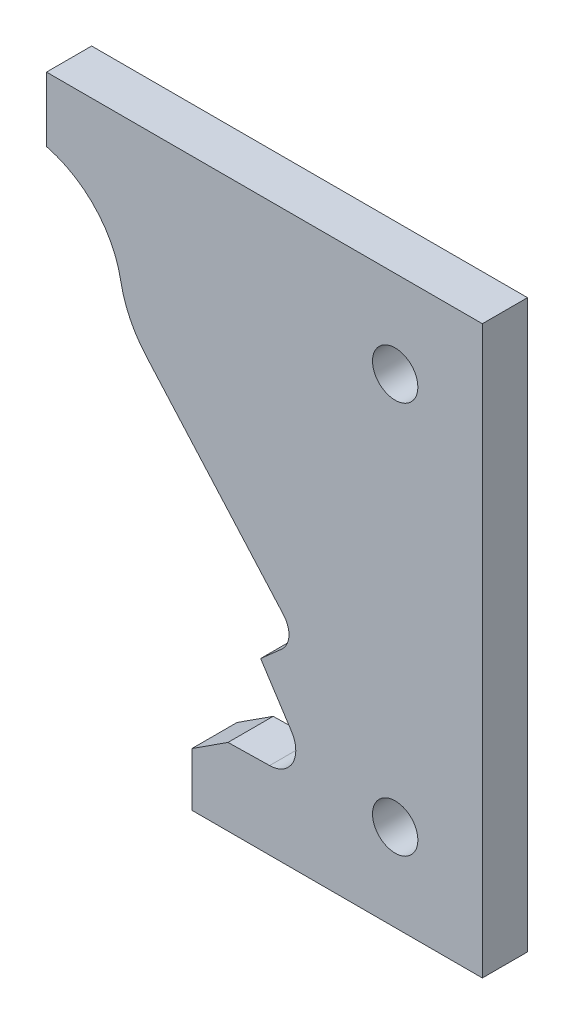
ISO-10303-21;
HEADER;
FILE_DESCRIPTION(('STEP AP214'),'2;1');
FILE_NAME('part.step','',(''),(''),'','','');
FILE_SCHEMA(('AUTOMOTIVE_DESIGN { 1 0 10303 214 1 1 1 1 }'));
ENDSEC;
DATA;
#1=APPLICATION_CONTEXT('core data for automotive mechanical design processes');
#2=APPLICATION_PROTOCOL_DEFINITION('international standard','automotive_design',2000,#1);
#3=PRODUCT_CONTEXT('',#1,'mechanical');
#4=PRODUCT('Part','Part','',(#3));
#5=PRODUCT_RELATED_PRODUCT_CATEGORY('part','',(#4));
#6=PRODUCT_DEFINITION_FORMATION('','',#4);
#7=PRODUCT_DEFINITION_CONTEXT('part definition',#1,'design');
#8=PRODUCT_DEFINITION('design','',#6,#7);
#9=PRODUCT_DEFINITION_SHAPE('','',#8);
#10=(LENGTH_UNIT() NAMED_UNIT(*) SI_UNIT(.MILLI.,.METRE.));
#11=(NAMED_UNIT(*) PLANE_ANGLE_UNIT() SI_UNIT($,.RADIAN.));
#12=(NAMED_UNIT(*) SI_UNIT($,.STERADIAN.) SOLID_ANGLE_UNIT());
#13=UNCERTAINTY_MEASURE_WITH_UNIT(LENGTH_MEASURE(1.E-05),#10,'distance_accuracy_value','');
#14=(GEOMETRIC_REPRESENTATION_CONTEXT(3) GLOBAL_UNCERTAINTY_ASSIGNED_CONTEXT((#13)) GLOBAL_UNIT_ASSIGNED_CONTEXT((#10,
#11,#12)) REPRESENTATION_CONTEXT('',''));
#15=CARTESIAN_POINT('',(0.,0.,0.));
#16=DIRECTION('',(0.,0.,1.));
#17=DIRECTION('',(1.,0.,0.));
#18=AXIS2_PLACEMENT_3D('',#15,#16,#17);
#19=CARTESIAN_POINT('',(36.1270333732644,-43.7914636928429,3.2893));
#20=DIRECTION('',(0.,0.,-1.));
#21=DIRECTION('',(-1.,0.,0.));
#22=AXIS2_PLACEMENT_3D('',#19,#20,#21);
#23=CYLINDRICAL_SURFACE('',#22,3.81);
#24=CARTESIAN_POINT('',(36.1270333732644,-43.7914636928429,-3.2893));
#25=DIRECTION('',(0.,0.,1.));
#26=DIRECTION('',(1.,0.,0.));
#27=AXIS2_PLACEMENT_3D('',#24,#25,#26);
#28=CIRCLE('',#27,3.81);
#29=CARTESIAN_POINT('',(36.1270333732644,-47.6014636928429,-3.2893));
#30=VERTEX_POINT('',#29);
#31=CARTESIAN_POINT('',(39.3256324450766,-41.721424085057,-3.2893));
#32=VERTEX_POINT('',#31);
#33=EDGE_CURVE('E153',#30,#32,#28,.T.);
#34=ORIENTED_EDGE('',*,*,#33,.F.);
#35=DIRECTION('',(0.,0.,-1.));
#36=VECTOR('',#35,1.);
#37=CARTESIAN_POINT('',(36.1270333732644,-47.6014636928429,3.2893));
#38=LINE('',#37,#36);
#39=CARTESIAN_POINT('',(36.1270333732644,-47.6014636928429,3.2893));
#40=VERTEX_POINT('',#39);
#41=EDGE_CURVE('E147',#40,#30,#38,.T.);
#42=ORIENTED_EDGE('',*,*,#41,.F.);
#43=CARTESIAN_POINT('',(36.1270333732644,-43.7914636928429,3.2893));
#44=DIRECTION('',(0.,0.,1.));
#45=DIRECTION('',(1.,0.,0.));
#46=AXIS2_PLACEMENT_3D('',#43,#44,#45);
#47=CIRCLE('',#46,3.81);
#48=CARTESIAN_POINT('',(39.3256324450766,-41.721424085057,3.2893));
#49=VERTEX_POINT('',#48);
#50=EDGE_CURVE('E150',#40,#49,#47,.T.);
#51=ORIENTED_EDGE('',*,*,#50,.T.);
#52=DIRECTION('',(0.,0.,-1.));
#53=VECTOR('',#52,1.);
#54=CARTESIAN_POINT('',(39.3256324450766,-41.721424085057,3.2893));
#55=LINE('',#54,#53);
#56=EDGE_CURVE('E205',#49,#32,#55,.T.);
#57=ORIENTED_EDGE('',*,*,#56,.T.);
#58=EDGE_LOOP('',(#34,#42,#51,#57));
#59=FACE_BOUND('',#58,.T.);
#60=ADVANCED_FACE('F47',(#59),#23,.F.);
#61=CARTESIAN_POINT('',(0.926057519267184,-48.2766989325326,3.2893));
#62=DIRECTION('',(0.0191787593313197,-0.999816070680258,0.));
#63=DIRECTION('',(0.999816070680258,0.0191787593313197,0.));
#64=AXIS2_PLACEMENT_3D('',#61,#62,#63);
#65=PLANE('',#64);
#66=DIRECTION('',(-0.999816070680258,-0.0191787593313197,0.));
#67=VECTOR('',#66,1.);
#68=CARTESIAN_POINT('',(0.926057519267184,-48.2766989325326,-3.2893));
#69=LINE('',#68,#67);
#70=CARTESIAN_POINT('',(30.0600424700748,-47.7178424567074,-3.2893));
#71=VERTEX_POINT('',#70);
#72=EDGE_CURVE('E209',#30,#71,#69,.T.);
#73=ORIENTED_EDGE('',*,*,#72,.T.);
#74=DIRECTION('',(0.,0.,-1.));
#75=VECTOR('',#74,1.);
#76=CARTESIAN_POINT('',(30.0600424700748,-47.7178424567074,3.2893));
#77=LINE('',#76,#75);
#78=CARTESIAN_POINT('',(30.0600424700748,-47.7178424567074,3.2893));
#79=VERTEX_POINT('',#78);
#80=EDGE_CURVE('E158',#79,#71,#77,.T.);
#81=ORIENTED_EDGE('',*,*,#80,.F.);
#82=DIRECTION('',(-0.999816070680258,-0.0191787593313197,0.));
#83=VECTOR('',#82,1.);
#84=CARTESIAN_POINT('',(0.926057519267184,-48.2766989325326,3.2893));
#85=LINE('',#84,#83);
#86=EDGE_CURVE('E161',#40,#79,#85,.T.);
#87=ORIENTED_EDGE('',*,*,#86,.F.);
#88=ORIENTED_EDGE('',*,*,#41,.T.);
#89=EDGE_LOOP('',(#73,#81,#87,#88));
#90=FACE_BOUND('',#89,.T.);
#91=ADVANCED_FACE('F162',(#90),#65,.F.);
#92=CARTESIAN_POINT('',(30.6390739213036,-47.3431102657428,3.2893));
#93=DIRECTION('',(-0.543317482358515,0.839527315436255,0.));
#94=DIRECTION('',(-0.839527315436255,-0.543317482358515,0.));
#95=AXIS2_PLACEMENT_3D('',#92,#93,#94);
#96=PLANE('',#95);
#97=DIRECTION('',(0.839527315436255,0.543317482358515,0.));
#98=VECTOR('',#97,1.);
#99=CARTESIAN_POINT('',(30.6390739213036,-47.3431102657428,-3.2893));
#100=LINE('',#99,#98);
#101=CARTESIAN_POINT('',(24.7935175974196,-51.1261830573972,-3.2893));
#102=VERTEX_POINT('',#101);
#103=EDGE_CURVE('E235',#102,#71,#100,.T.);
#104=ORIENTED_EDGE('',*,*,#103,.F.);
#105=DIRECTION('',(0.,0.,-1.));
#106=VECTOR('',#105,1.);
#107=CARTESIAN_POINT('',(24.7935175974196,-51.1261830573972,3.2893));
#108=LINE('',#107,#106);
#109=CARTESIAN_POINT('',(24.7935175974196,-51.1261830573972,3.2893));
#110=VERTEX_POINT('',#109);
#111=EDGE_CURVE('E287',#110,#102,#108,.T.);
#112=ORIENTED_EDGE('',*,*,#111,.F.);
#113=DIRECTION('',(0.839527315436255,0.543317482358515,0.));
#114=VECTOR('',#113,1.);
#115=CARTESIAN_POINT('',(30.6390739213036,-47.3431102657428,3.2893));
#116=LINE('',#115,#114);
#117=EDGE_CURVE('E166',#110,#79,#116,.T.);
#118=ORIENTED_EDGE('',*,*,#117,.T.);
#119=ORIENTED_EDGE('',*,*,#80,.T.);
#120=EDGE_LOOP('',(#104,#112,#118,#119));
#121=FACE_BOUND('',#120,.T.);
#122=ADVANCED_FACE('F340',(#121),#96,.T.);
#123=CARTESIAN_POINT('',(24.7935175974196,0.,3.2893));
#124=DIRECTION('',(1.,0.,0.));
#125=DIRECTION('',(0.,1.,0.));
#126=AXIS2_PLACEMENT_3D('',#123,#124,#125);
#127=PLANE('',#126);
#128=DIRECTION('',(0.,-1.,0.));
#129=VECTOR('',#128,1.);
#130=CARTESIAN_POINT('',(24.7935175974196,0.,-3.2893));
#131=LINE('',#130,#129);
#132=CARTESIAN_POINT('',(24.7935175974196,-58.9143197939274,-3.2893));
#133=VERTEX_POINT('',#132);
#134=EDGE_CURVE('E239',#102,#133,#131,.T.);
#135=ORIENTED_EDGE('',*,*,#134,.T.);
#136=DIRECTION('',(0.,0.,-1.));
#137=VECTOR('',#136,1.);
#138=CARTESIAN_POINT('',(24.7935175974196,-58.9143197939274,3.2893));
#139=LINE('',#138,#137);
#140=CARTESIAN_POINT('',(24.7935175974196,-58.9143197939274,3.2893));
#141=VERTEX_POINT('',#140);
#142=EDGE_CURVE('E289',#141,#133,#139,.T.);
#143=ORIENTED_EDGE('',*,*,#142,.F.);
#144=DIRECTION('',(0.,-1.,0.));
#145=VECTOR('',#144,1.);
#146=CARTESIAN_POINT('',(24.7935175974196,0.,3.2893));
#147=LINE('',#146,#145);
#148=EDGE_CURVE('E336',#110,#141,#147,.T.);
#149=ORIENTED_EDGE('',*,*,#148,.F.);
#150=ORIENTED_EDGE('',*,*,#111,.T.);
#151=EDGE_LOOP('',(#135,#143,#149,#150));
#152=FACE_BOUND('',#151,.T.);
#153=ADVANCED_FACE('F323',(#152),#127,.F.);
#154=CARTESIAN_POINT('',(0.,-58.9143197939274,3.2893));
#155=DIRECTION('',(0.,1.,0.));
#156=DIRECTION('',(0.,0.,1.));
#157=AXIS2_PLACEMENT_3D('',#154,#155,#156);
#158=PLANE('',#157);
#159=DIRECTION('',(1.,0.,0.));
#160=VECTOR('',#159,1.);
#161=CARTESIAN_POINT('',(0.,-58.9143197939274,-3.2893));
#162=LINE('',#161,#160);
#163=CARTESIAN_POINT('',(67.1159222864692,-58.9143197939274,-3.2893));
#164=VERTEX_POINT('',#163);
#165=EDGE_CURVE('E313',#133,#164,#162,.T.);
#166=ORIENTED_EDGE('',*,*,#165,.T.);
#167=DIRECTION('',(0.,0.,-1.));
#168=VECTOR('',#167,1.);
#169=CARTESIAN_POINT('',(67.1159222864692,-58.9143197939274,3.2893));
#170=LINE('',#169,#168);
#171=CARTESIAN_POINT('',(67.1159222864692,-58.9143197939274,3.2893));
#172=VERTEX_POINT('',#171);
#173=EDGE_CURVE('E292',#172,#164,#170,.T.);
#174=ORIENTED_EDGE('',*,*,#173,.F.);
#175=DIRECTION('',(1.,0.,0.));
#176=VECTOR('',#175,1.);
#177=CARTESIAN_POINT('',(0.,-58.9143197939274,3.2893));
#178=LINE('',#177,#176);
#179=EDGE_CURVE('E328',#141,#172,#178,.T.);
#180=ORIENTED_EDGE('',*,*,#179,.F.);
#181=ORIENTED_EDGE('',*,*,#142,.T.);
#182=EDGE_LOOP('',(#166,#174,#180,#181));
#183=FACE_BOUND('',#182,.T.);
#184=ADVANCED_FACE('F327',(#183),#158,.F.);
#185=CARTESIAN_POINT('',(67.1159222864692,0.,3.2893));
#186=DIRECTION('',(1.,0.,0.));
#187=DIRECTION('',(0.,0.,-1.));
#188=AXIS2_PLACEMENT_3D('',#185,#186,#187);
#189=PLANE('',#188);
#190=DIRECTION('',(0.,-1.,0.));
#191=VECTOR('',#190,1.);
#192=CARTESIAN_POINT('',(67.1159222864692,0.,-3.2893));
#193=LINE('',#192,#191);
#194=CARTESIAN_POINT('',(67.1159222864692,23.6356802060726,-3.2893));
#195=VERTEX_POINT('',#194);
#196=EDGE_CURVE('E312',#195,#164,#193,.T.);
#197=ORIENTED_EDGE('',*,*,#196,.F.);
#198=DIRECTION('',(0.,0.,-1.));
#199=VECTOR('',#198,1.);
#200=CARTESIAN_POINT('',(67.1159222864692,23.6356802060726,3.2893));
#201=LINE('',#200,#199);
#202=CARTESIAN_POINT('',(67.1159222864692,23.6356802060726,3.2893));
#203=VERTEX_POINT('',#202);
#204=EDGE_CURVE('E293',#203,#195,#201,.T.);
#205=ORIENTED_EDGE('',*,*,#204,.F.);
#206=DIRECTION('',(0.,-1.,0.));
#207=VECTOR('',#206,1.);
#208=CARTESIAN_POINT('',(67.1159222864692,0.,3.2893));
#209=LINE('',#208,#207);
#210=EDGE_CURVE('E333',#203,#172,#209,.T.);
#211=ORIENTED_EDGE('',*,*,#210,.T.);
#212=ORIENTED_EDGE('',*,*,#173,.T.);
#213=EDGE_LOOP('',(#197,#205,#211,#212));
#214=FACE_BOUND('',#213,.T.);
#215=ADVANCED_FACE('F330',(#214),#189,.T.);
#216=CARTESIAN_POINT('',(0.,23.6356802060726,3.2893));
#217=DIRECTION('',(0.,1.,0.));
#218=DIRECTION('',(-1.,0.,0.));
#219=AXIS2_PLACEMENT_3D('',#216,#217,#218);
#220=PLANE('',#219);
#221=DIRECTION('',(1.,0.,0.));
#222=VECTOR('',#221,1.);
#223=CARTESIAN_POINT('',(0.,23.6356802060726,-3.2893));
#224=LINE('',#223,#222);
#225=CARTESIAN_POINT('',(3.61592228646916,23.6356802060726,-3.2893));
#226=VERTEX_POINT('',#225);
#227=EDGE_CURVE('E308',#226,#195,#224,.T.);
#228=ORIENTED_EDGE('',*,*,#227,.F.);
#229=DIRECTION('',(0.,0.,-1.));
#230=VECTOR('',#229,1.);
#231=CARTESIAN_POINT('',(3.61592228646916,23.6356802060726,3.2893));
#232=LINE('',#231,#230);
#233=CARTESIAN_POINT('',(3.61592228646916,23.6356802060726,3.2893));
#234=VERTEX_POINT('',#233);
#235=EDGE_CURVE('E274',#234,#226,#232,.T.);
#236=ORIENTED_EDGE('',*,*,#235,.F.);
#237=DIRECTION('',(1.,0.,0.));
#238=VECTOR('',#237,1.);
#239=CARTESIAN_POINT('',(0.,23.6356802060726,3.2893));
#240=LINE('',#239,#238);
#241=EDGE_CURVE('E334',#234,#203,#240,.T.);
#242=ORIENTED_EDGE('',*,*,#241,.T.);
#243=ORIENTED_EDGE('',*,*,#204,.T.);
#244=EDGE_LOOP('',(#228,#236,#242,#243));
#245=FACE_BOUND('',#244,.T.);
#246=ADVANCED_FACE('F311',(#245),#220,.T.);
#247=CARTESIAN_POINT('',(3.61592228646917,0.,3.2893));
#248=DIRECTION('',(1.,0.,0.));
#249=DIRECTION('',(0.,1.,0.));
#250=AXIS2_PLACEMENT_3D('',#247,#248,#249);
#251=PLANE('',#250);
#252=DIRECTION('',(0.,-1.,0.));
#253=VECTOR('',#252,1.);
#254=CARTESIAN_POINT('',(3.61592228646917,0.,-3.2893));
#255=LINE('',#254,#253);
#256=CARTESIAN_POINT('',(3.61592228646916,14.237438208854,-3.2893));
#257=VERTEX_POINT('',#256);
#258=EDGE_CURVE('E257',#226,#257,#255,.T.);
#259=ORIENTED_EDGE('',*,*,#258,.T.);
#260=DIRECTION('',(0.,0.,-1.));
#261=VECTOR('',#260,1.);
#262=CARTESIAN_POINT('',(3.61592228646916,14.237438208854,3.2893));
#263=LINE('',#262,#261);
#264=CARTESIAN_POINT('',(3.61592228646916,14.237438208854,3.2893));
#265=VERTEX_POINT('',#264);
#266=EDGE_CURVE('E271',#265,#257,#263,.T.);
#267=ORIENTED_EDGE('',*,*,#266,.F.);
#268=DIRECTION('',(0.,-1.,0.));
#269=VECTOR('',#268,1.);
#270=CARTESIAN_POINT('',(3.61592228646917,0.,3.2893));
#271=LINE('',#270,#269);
#272=EDGE_CURVE('E196',#234,#265,#271,.T.);
#273=ORIENTED_EDGE('',*,*,#272,.F.);
#274=ORIENTED_EDGE('',*,*,#235,.T.);
#275=EDGE_LOOP('',(#259,#267,#273,#274));
#276=FACE_BOUND('',#275,.T.);
#277=ADVANCED_FACE('F302',(#276),#251,.F.);
#278=CARTESIAN_POINT('',(0.00718526177838179,0.00667398037258216,3.2893));
#279=DIRECTION('',(0.,0.,-1.));
#280=DIRECTION('',(-1.,0.,0.));
#281=AXIS2_PLACEMENT_3D('',#278,#279,#280);
#282=CYLINDRICAL_SURFACE('',#281,14.6812);
#283=CARTESIAN_POINT('',(0.00718526177838179,0.00667398037258216,-3.2893));
#284=DIRECTION('',(0.,0.,1.));
#285=DIRECTION('',(1.,0.,0.));
#286=AXIS2_PLACEMENT_3D('',#283,#284,#285);
#287=CIRCLE('',#286,14.6812);
#288=CARTESIAN_POINT('',(14.4650532696959,2.55769066115574,-3.2893));
#289=VERTEX_POINT('',#288);
#290=EDGE_CURVE('E250',#289,#257,#287,.T.);
#291=ORIENTED_EDGE('',*,*,#290,.F.);
#292=DIRECTION('',(0.,0.,-1.));
#293=VECTOR('',#292,1.);
#294=CARTESIAN_POINT('',(14.4650532696959,2.55769066115574,3.2893));
#295=LINE('',#294,#293);
#296=CARTESIAN_POINT('',(14.4650532696959,2.55769066115574,3.2893));
#297=VERTEX_POINT('',#296);
#298=EDGE_CURVE('E268',#297,#289,#295,.T.);
#299=ORIENTED_EDGE('',*,*,#298,.F.);
#300=CARTESIAN_POINT('',(0.00718526177838179,0.00667398037258216,3.2893));
#301=DIRECTION('',(0.,0.,1.));
#302=DIRECTION('',(1.,0.,0.));
#303=AXIS2_PLACEMENT_3D('',#300,#301,#302);
#304=CIRCLE('',#303,14.6812);
#305=EDGE_CURVE('E190',#297,#265,#304,.T.);
#306=ORIENTED_EDGE('',*,*,#305,.T.);
#307=ORIENTED_EDGE('',*,*,#266,.T.);
#308=EDGE_LOOP('',(#291,#299,#306,#307));
#309=FACE_BOUND('',#308,.T.);
#310=ADVANCED_FACE('F399',(#309),#282,.F.);
#311=CARTESIAN_POINT('',(30.0600424700748,5.55858584420667,3.2893));
#312=DIRECTION('',(0.,0.,-1.));
#313=DIRECTION('',(-1.,0.,0.));
#314=AXIS2_PLACEMENT_3D('',#311,#312,#313);
#315=CYLINDRICAL_SURFACE('',#314,15.8810912742037);
#316=CARTESIAN_POINT('',(30.0600424700748,5.55858584420667,-3.2893));
#317=DIRECTION('',(0.,0.,1.));
#318=DIRECTION('',(1.,0.,0.));
#319=AXIS2_PLACEMENT_3D('',#316,#317,#318);
#320=CIRCLE('',#319,15.8810912742037);
#321=CARTESIAN_POINT('',(18.1591070687582,-4.95696438549039,-3.2893));
#322=VERTEX_POINT('',#321);
#323=EDGE_CURVE('E256',#322,#289,#320,.F.);
#324=ORIENTED_EDGE('',*,*,#323,.F.);
#325=DIRECTION('',(0.,0.,-1.));
#326=VECTOR('',#325,1.);
#327=CARTESIAN_POINT('',(18.1591070687582,-4.95696438549039,3.2893));
#328=LINE('',#327,#326);
#329=CARTESIAN_POINT('',(18.1591070687582,-4.95696438549039,3.2893));
#330=VERTEX_POINT('',#329);
#331=EDGE_CURVE('E227',#330,#322,#328,.T.);
#332=ORIENTED_EDGE('',*,*,#331,.F.);
#333=CARTESIAN_POINT('',(30.0600424700748,5.55858584420667,3.2893));
#334=DIRECTION('',(0.,0.,1.));
#335=DIRECTION('',(1.,0.,0.));
#336=AXIS2_PLACEMENT_3D('',#333,#334,#335);
#337=CIRCLE('',#336,15.8810912742037);
#338=EDGE_CURVE('E195',#330,#297,#337,.F.);
#339=ORIENTED_EDGE('',*,*,#338,.T.);
#340=ORIENTED_EDGE('',*,*,#298,.T.);
#341=EDGE_LOOP('',(#324,#332,#339,#340));
#342=FACE_BOUND('',#341,.T.);
#343=ADVANCED_FACE('F402',(#342),#315,.T.);
#344=CARTESIAN_POINT('',(7.73793258064781,6.83716161645664,3.2893));
#345=DIRECTION('',(-0.749377684180158,-0.662142799139871,0.));
#346=DIRECTION('',(0.662142799139871,-0.749377684180158,0.));
#347=AXIS2_PLACEMENT_3D('',#344,#345,#346);
#348=PLANE('',#347);
#349=DIRECTION('',(-0.662142799139871,0.749377684180158,0.));
#350=VECTOR('',#349,1.);
#351=CARTESIAN_POINT('',(7.73793258064781,6.83716161645664,-3.2893));
#352=LINE('',#351,#350);
#353=CARTESIAN_POINT('',(38.1429154940791,-27.5735662700387,-3.2893));
#354=VERTEX_POINT('',#353);
#355=EDGE_CURVE('E344',#354,#322,#352,.T.);
#356=ORIENTED_EDGE('',*,*,#355,.F.);
#357=DIRECTION('',(0.,0.,-1.));
#358=VECTOR('',#357,1.);
#359=CARTESIAN_POINT('',(38.1429154940791,-27.5735662700387,3.2893));
#360=LINE('',#359,#358);
#361=CARTESIAN_POINT('',(38.1429154940791,-27.5735662700387,3.2893));
#362=VERTEX_POINT('',#361);
#363=EDGE_CURVE('E62',#354,#362,#360,.F.);
#364=ORIENTED_EDGE('',*,*,#363,.T.);
#365=DIRECTION('',(-0.662142799139871,0.749377684180158,0.));
#366=VECTOR('',#365,1.);
#367=CARTESIAN_POINT('',(7.73793258064781,6.83716161645664,3.2893));
#368=LINE('',#367,#366);
#369=EDGE_CURVE('E200',#362,#330,#368,.T.);
#370=ORIENTED_EDGE('',*,*,#369,.T.);
#371=ORIENTED_EDGE('',*,*,#331,.T.);
#372=EDGE_LOOP('',(#356,#364,#370,#371));
#373=FACE_BOUND('',#372,.T.);
#374=ADVANCED_FACE('F406',(#373),#348,.T.);
#375=CARTESIAN_POINT('',(32.5072863006915,-36.7900020337731,3.2893));
#376=DIRECTION('',(-0.66214279913971,0.7493776841803,0.));
#377=DIRECTION('',(-0.7493776841803,-0.66214279913971,0.));
#378=AXIS2_PLACEMENT_3D('',#375,#376,#377);
#379=PLANE('',#378);
#380=DIRECTION('',(0.7493776841803,0.66214279913971,0.));
#381=VECTOR('',#380,1.);
#382=CARTESIAN_POINT('',(32.5072863006915,-36.7900020337731,3.2893));
#383=LINE('',#382,#381);
#384=CARTESIAN_POINT('',(34.8147023154232,-34.7511917902502,3.2893));
#385=VERTEX_POINT('',#384);
#386=CARTESIAN_POINT('',(37.8659447340757,-32.0551438045802,3.2893));
#387=VERTEX_POINT('',#386);
#388=EDGE_CURVE('E202',#385,#387,#383,.T.);
#389=ORIENTED_EDGE('',*,*,#388,.T.);
#390=DIRECTION('',(0.,0.,-1.));
#391=VECTOR('',#390,1.);
#392=CARTESIAN_POINT('',(37.8659447340757,-32.0551438045802,-3.2893));
#393=LINE('',#392,#391);
#394=CARTESIAN_POINT('',(37.8659447340757,-32.0551438045802,-3.2893));
#395=VERTEX_POINT('',#394);
#396=EDGE_CURVE('E157',#387,#395,#393,.T.);
#397=ORIENTED_EDGE('',*,*,#396,.T.);
#398=DIRECTION('',(0.7493776841803,0.66214279913971,0.));
#399=VECTOR('',#398,1.);
#400=CARTESIAN_POINT('',(32.5072863006915,-36.7900020337731,-3.2893));
#401=LINE('',#400,#399);
#402=CARTESIAN_POINT('',(34.8147023154232,-34.7511917902502,-3.2893));
#403=VERTEX_POINT('',#402);
#404=EDGE_CURVE('E175',#403,#395,#401,.T.);
#405=ORIENTED_EDGE('',*,*,#404,.F.);
#406=DIRECTION('',(0.,0.,-1.));
#407=VECTOR('',#406,1.);
#408=CARTESIAN_POINT('',(34.8147023154232,-34.7511917902502,3.2893));
#409=LINE('',#408,#407);
#410=EDGE_CURVE('E222',#385,#403,#409,.T.);
#411=ORIENTED_EDGE('',*,*,#410,.F.);
#412=EDGE_LOOP('',(#389,#397,#405,#411));
#413=FACE_BOUND('',#412,.T.);
#414=ADVANCED_FACE('F410',(#413),#379,.T.);
#415=CARTESIAN_POINT('',(8.68655852377377,5.62168618068611,3.2893));
#416=DIRECTION('',(-0.839527315436263,-0.543317482358502,0.));
#417=DIRECTION('',(0.543317482358502,-0.839527315436263,0.));
#418=AXIS2_PLACEMENT_3D('',#415,#416,#417);
#419=PLANE('',#418);
#420=DIRECTION('',(-0.543317482358502,0.839527315436263,0.));
#421=VECTOR('',#420,1.);
#422=CARTESIAN_POINT('',(8.68655852377377,5.62168618068611,-3.2893));
#423=LINE('',#422,#421);
#424=EDGE_CURVE('E172',#32,#403,#423,.T.);
#425=ORIENTED_EDGE('',*,*,#424,.F.);
#426=ORIENTED_EDGE('',*,*,#56,.F.);
#427=DIRECTION('',(-0.543317482358502,0.839527315436263,0.));
#428=VECTOR('',#427,1.);
#429=CARTESIAN_POINT('',(8.68655852377377,5.62168618068611,3.2893));
#430=LINE('',#429,#428);
#431=EDGE_CURVE('E171',#49,#385,#430,.T.);
#432=ORIENTED_EDGE('',*,*,#431,.T.);
#433=ORIENTED_EDGE('',*,*,#410,.T.);
#434=EDGE_LOOP('',(#425,#426,#432,#433));
#435=FACE_BOUND('',#434,.T.);
#436=ADVANCED_FACE('F413',(#435),#419,.T.);
#437=CARTESIAN_POINT('',(0.,0.,3.2893));
#438=DIRECTION('',(0.,0.,1.));
#439=DIRECTION('',(1.,0.,0.));
#440=AXIS2_PLACEMENT_3D('',#437,#438,#439);
#441=PLANE('',#440);
#442=CARTESIAN_POINT('',(54.4159222864692,10.9356802060726,3.2893));
#443=DIRECTION('',(0.,0.,1.));
#444=DIRECTION('',(1.,0.,0.));
#445=AXIS2_PLACEMENT_3D('',#442,#443,#444);
#446=CIRCLE('',#445,3.302);
#447=CARTESIAN_POINT('',(57.7179222864692,10.9356802060726,3.2893));
#448=VERTEX_POINT('',#447);
#449=EDGE_CURVE('E354',#448,#448,#446,.T.);
#450=ORIENTED_EDGE('',*,*,#449,.F.);
#451=EDGE_LOOP('',(#450));
#452=FACE_BOUND('',#451,.T.);
#453=CARTESIAN_POINT('',(54.4159222864692,-46.2143197939274,3.2893));
#454=DIRECTION('',(0.,0.,1.));
#455=DIRECTION('',(1.,0.,0.));
#456=AXIS2_PLACEMENT_3D('',#453,#454,#455);
#457=CIRCLE('',#456,3.302);
#458=CARTESIAN_POINT('',(57.7179222864692,-46.2143197939274,3.2893));
#459=VERTEX_POINT('',#458);
#460=EDGE_CURVE('E360',#459,#459,#457,.T.);
#461=ORIENTED_EDGE('',*,*,#460,.F.);
#462=EDGE_LOOP('',(#461));
#463=FACE_BOUND('',#462,.T.);
#464=ORIENTED_EDGE('',*,*,#50,.F.);
#465=ORIENTED_EDGE('',*,*,#86,.T.);
#466=ORIENTED_EDGE('',*,*,#117,.F.);
#467=ORIENTED_EDGE('',*,*,#148,.T.);
#468=ORIENTED_EDGE('',*,*,#179,.T.);
#469=ORIENTED_EDGE('',*,*,#210,.F.);
#470=ORIENTED_EDGE('',*,*,#241,.F.);
#471=ORIENTED_EDGE('',*,*,#272,.T.);
#472=ORIENTED_EDGE('',*,*,#305,.F.);
#473=ORIENTED_EDGE('',*,*,#338,.F.);
#474=ORIENTED_EDGE('',*,*,#369,.F.);
#475=CARTESIAN_POINT('',(35.7636413468071,-29.6758696573078,3.2893));
#476=DIRECTION('',(0.,0.,1.));
#477=DIRECTION('',(1.,0.,0.));
#478=AXIS2_PLACEMENT_3D('',#475,#476,#477);
#479=CIRCLE('',#478,3.175);
#480=EDGE_CURVE('E12',#362,#387,#479,.F.);
#481=ORIENTED_EDGE('',*,*,#480,.T.);
#482=ORIENTED_EDGE('',*,*,#388,.F.);
#483=ORIENTED_EDGE('',*,*,#431,.F.);
#484=EDGE_LOOP('',(#464,#465,#466,#467,#468,#469,#470,#471,#472,#473,#474,#481,#482,#483));
#485=FACE_BOUND('',#484,.T.);
#486=ADVANCED_FACE('F168',(#452,#463,#485),#441,.T.);
#487=CARTESIAN_POINT('',(0.,0.,-3.2893));
#488=DIRECTION('',(0.,0.,1.));
#489=DIRECTION('',(1.,0.,0.));
#490=AXIS2_PLACEMENT_3D('',#487,#488,#489);
#491=PLANE('',#490);
#492=CARTESIAN_POINT('',(54.4159222864692,10.9356802060726,-3.2893));
#493=DIRECTION('',(0.,0.,1.));
#494=DIRECTION('',(1.,0.,0.));
#495=AXIS2_PLACEMENT_3D('',#492,#493,#494);
#496=CIRCLE('',#495,3.302);
#497=CARTESIAN_POINT('',(57.7179222864692,10.9356802060726,-3.2893));
#498=VERTEX_POINT('',#497);
#499=EDGE_CURVE('E357',#498,#498,#496,.T.);
#500=ORIENTED_EDGE('',*,*,#499,.T.);
#501=EDGE_LOOP('',(#500));
#502=FACE_BOUND('',#501,.T.);
#503=CARTESIAN_POINT('',(54.4159222864692,-46.2143197939274,-3.2893));
#504=DIRECTION('',(0.,0.,1.));
#505=DIRECTION('',(1.,0.,0.));
#506=AXIS2_PLACEMENT_3D('',#503,#504,#505);
#507=CIRCLE('',#506,3.302);
#508=CARTESIAN_POINT('',(57.7179222864692,-46.2143197939274,-3.2893));
#509=VERTEX_POINT('',#508);
#510=EDGE_CURVE('E179',#509,#509,#507,.T.);
#511=ORIENTED_EDGE('',*,*,#510,.T.);
#512=EDGE_LOOP('',(#511));
#513=FACE_BOUND('',#512,.T.);
#514=ORIENTED_EDGE('',*,*,#33,.T.);
#515=ORIENTED_EDGE('',*,*,#424,.T.);
#516=ORIENTED_EDGE('',*,*,#404,.T.);
#517=CARTESIAN_POINT('',(35.7636413468071,-29.6758696573078,-3.2893));
#518=DIRECTION('',(0.,0.,1.));
#519=DIRECTION('',(1.,0.,0.));
#520=AXIS2_PLACEMENT_3D('',#517,#518,#519);
#521=CIRCLE('',#520,3.175);
#522=EDGE_CURVE('E55',#395,#354,#521,.T.);
#523=ORIENTED_EDGE('',*,*,#522,.T.);
#524=ORIENTED_EDGE('',*,*,#355,.T.);
#525=ORIENTED_EDGE('',*,*,#323,.T.);
#526=ORIENTED_EDGE('',*,*,#290,.T.);
#527=ORIENTED_EDGE('',*,*,#258,.F.);
#528=ORIENTED_EDGE('',*,*,#227,.T.);
#529=ORIENTED_EDGE('',*,*,#196,.T.);
#530=ORIENTED_EDGE('',*,*,#165,.F.);
#531=ORIENTED_EDGE('',*,*,#134,.F.);
#532=ORIENTED_EDGE('',*,*,#103,.T.);
#533=ORIENTED_EDGE('',*,*,#72,.F.);
#534=EDGE_LOOP('',(#514,#515,#516,#523,#524,#525,#526,#527,#528,#529,#530,#531,#532,#533));
#535=FACE_BOUND('',#534,.T.);
#536=ADVANCED_FACE('F306',(#502,#513,#535),#491,.F.);
#537=CARTESIAN_POINT('',(35.7636413468071,-29.6758696573078,3.2893));
#538=DIRECTION('',(0.,0.,1.));
#539=DIRECTION('',(1.,0.,0.));
#540=AXIS2_PLACEMENT_3D('',#537,#538,#539);
#541=CYLINDRICAL_SURFACE('',#540,3.175);
#542=ORIENTED_EDGE('',*,*,#480,.F.);
#543=ORIENTED_EDGE('',*,*,#363,.F.);
#544=ORIENTED_EDGE('',*,*,#522,.F.);
#545=ORIENTED_EDGE('',*,*,#396,.F.);
#546=EDGE_LOOP('',(#542,#543,#544,#545));
#547=FACE_BOUND('',#546,.T.);
#548=ADVANCED_FACE('F49',(#547),#541,.F.);
#549=CARTESIAN_POINT('',(54.4159222864692,-46.2143197939274,3.2893));
#550=DIRECTION('',(0.,0.,1.));
#551=DIRECTION('',(1.,0.,0.));
#552=AXIS2_PLACEMENT_3D('',#549,#550,#551);
#553=CYLINDRICAL_SURFACE('',#552,3.302);
#554=ORIENTED_EDGE('',*,*,#510,.F.);
#555=EDGE_LOOP('',(#554));
#556=FACE_BOUND('',#555,.T.);
#557=ORIENTED_EDGE('',*,*,#460,.T.);
#558=EDGE_LOOP('',(#557));
#559=FACE_BOUND('',#558,.T.);
#560=ADVANCED_FACE('F369',(#556,#559),#553,.F.);
#561=CARTESIAN_POINT('',(54.4159222864692,10.9356802060726,3.2893));
#562=DIRECTION('',(0.,0.,1.));
#563=DIRECTION('',(1.,0.,0.));
#564=AXIS2_PLACEMENT_3D('',#561,#562,#563);
#565=CYLINDRICAL_SURFACE('',#564,3.302);
#566=ORIENTED_EDGE('',*,*,#499,.F.);
#567=EDGE_LOOP('',(#566));
#568=FACE_BOUND('',#567,.T.);
#569=ORIENTED_EDGE('',*,*,#449,.T.);
#570=EDGE_LOOP('',(#569));
#571=FACE_BOUND('',#570,.T.);
#572=ADVANCED_FACE('F371',(#568,#571),#565,.F.);
#573=CLOSED_SHELL('',(#60,#91,#122,#153,#184,#215,#246,#277,#310,#343,#374,#414,#436,#486,#536,
#548,#560,#572));
#574=MANIFOLD_SOLID_BREP('B2',#573);
#575=ADVANCED_BREP_SHAPE_REPRESENTATION('',(#18,#574),#14);
#576=SHAPE_DEFINITION_REPRESENTATION(#9,#575);
ENDSEC;
END-ISO-10303-21;
